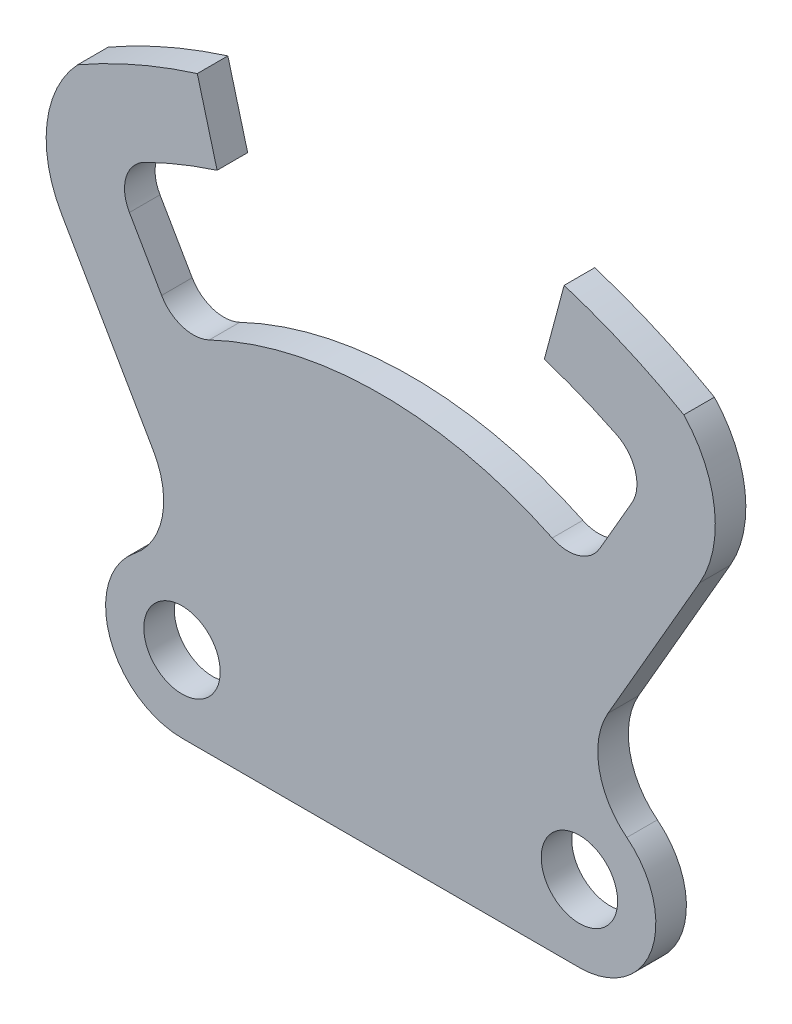
ISO-10303-21;
HEADER;
FILE_DESCRIPTION(('STEP AP214'),'2;1');
FILE_NAME('part.step','',(''),(''),'','','');
FILE_SCHEMA(('AUTOMOTIVE_DESIGN { 1 0 10303 214 1 1 1 1 }'));
ENDSEC;
DATA;
#1=APPLICATION_CONTEXT('core data for automotive mechanical design processes');
#2=APPLICATION_PROTOCOL_DEFINITION('international standard','automotive_design',2000,#1);
#3=PRODUCT_CONTEXT('',#1,'mechanical');
#4=PRODUCT('Part','Part','',(#3));
#5=PRODUCT_RELATED_PRODUCT_CATEGORY('part','',(#4));
#6=PRODUCT_DEFINITION_FORMATION('','',#4);
#7=PRODUCT_DEFINITION_CONTEXT('part definition',#1,'design');
#8=PRODUCT_DEFINITION('design','',#6,#7);
#9=PRODUCT_DEFINITION_SHAPE('','',#8);
#10=(LENGTH_UNIT() NAMED_UNIT(*) SI_UNIT(.MILLI.,.METRE.));
#11=(NAMED_UNIT(*) PLANE_ANGLE_UNIT() SI_UNIT($,.RADIAN.));
#12=(NAMED_UNIT(*) SI_UNIT($,.STERADIAN.) SOLID_ANGLE_UNIT());
#13=UNCERTAINTY_MEASURE_WITH_UNIT(LENGTH_MEASURE(1.E-05),#10,'distance_accuracy_value','');
#14=(GEOMETRIC_REPRESENTATION_CONTEXT(3) GLOBAL_UNCERTAINTY_ASSIGNED_CONTEXT((#13)) GLOBAL_UNIT_ASSIGNED_CONTEXT((#10,
#11,#12)) REPRESENTATION_CONTEXT('',''));
#15=CARTESIAN_POINT('',(0.,0.,0.));
#16=DIRECTION('',(0.,0.,1.));
#17=DIRECTION('',(1.,0.,0.));
#18=AXIS2_PLACEMENT_3D('',#15,#16,#17);
#19=CARTESIAN_POINT('',(65.,25.,10.));
#20=DIRECTION('',(0.,0.,1.));
#21=DIRECTION('',(1.,0.,0.));
#22=AXIS2_PLACEMENT_3D('',#19,#20,#21);
#23=PLANE('',#22);
#24=CARTESIAN_POINT('',(65.,25.,10.));
#25=DIRECTION('',(0.,0.,1.));
#26=DIRECTION('',(1.,0.,0.));
#27=AXIS2_PLACEMENT_3D('',#24,#25,#26);
#28=CIRCLE('',#27,12.5);
#29=CARTESIAN_POINT('',(77.5,25.,10.));
#30=VERTEX_POINT('',#29);
#31=EDGE_CURVE('E224',#30,#30,#28,.T.);
#32=ORIENTED_EDGE('',*,*,#31,.F.);
#33=EDGE_LOOP('',(#32));
#34=FACE_BOUND('',#33,.T.);
#35=CARTESIAN_POINT('',(65.,25.,10.));
#36=DIRECTION('',(0.,0.,1.));
#37=DIRECTION('',(1.,0.,0.));
#38=AXIS2_PLACEMENT_3D('',#35,#36,#37);
#39=CIRCLE('',#38,25.);
#40=CARTESIAN_POINT('',(65.,0.,10.));
#41=VERTEX_POINT('',#40);
#42=CARTESIAN_POINT('',(80.4997620073946,44.615233307665,10.));
#43=VERTEX_POINT('',#42);
#44=EDGE_CURVE('E263',#41,#43,#39,.T.);
#45=ORIENTED_EDGE('',*,*,#44,.T.);
#46=CARTESIAN_POINT('',(95.9995240147891,64.2304666153299,10.));
#47=DIRECTION('',(0.,0.,-1.));
#48=DIRECTION('',(-1.,0.,0.));
#49=AXIS2_PLACEMENT_3D('',#46,#47,#48);
#50=CIRCLE('',#49,25.);
#51=CARTESIAN_POINT('',(74.3488889201782,76.7304666153299,10.));
#52=VERTEX_POINT('',#51);
#53=EDGE_CURVE('E141',#43,#52,#50,.T.);
#54=ORIENTED_EDGE('',*,*,#53,.T.);
#55=DIRECTION('',(0.5,0.866025403784438,0.));
#56=VECTOR('',#55,1.);
#57=CARTESIAN_POINT('',(74.3488889201782,76.7304666153299,10.));
#58=LINE('',#57,#56);
#59=CARTESIAN_POINT('',(104.348888920178,128.691990842396,10.));
#60=VERTEX_POINT('',#59);
#61=EDGE_CURVE('E320',#52,#60,#58,.T.);
#62=ORIENTED_EDGE('',*,*,#61,.T.);
#63=CARTESIAN_POINT('',(71.4399235763695,147.691990842396,10.));
#64=DIRECTION('',(0.,0.,1.));
#65=DIRECTION('',(1.,0.,0.));
#66=AXIS2_PLACEMENT_3D('',#63,#64,#65);
#67=CIRCLE('',#66,38.);
#68=CARTESIAN_POINT('',(99.1537415113706,173.690919579281,10.));
#69=VERTEX_POINT('',#68);
#70=EDGE_CURVE('E339',#60,#69,#67,.T.);
#71=ORIENTED_EDGE('',*,*,#70,.T.);
#72=CARTESIAN_POINT('',(0.,0.,10.));
#73=DIRECTION('',(0.,0.,1.));
#74=DIRECTION('',(1.,0.,0.));
#75=AXIS2_PLACEMENT_3D('',#72,#73,#74);
#76=CIRCLE('',#75,200.);
#77=CARTESIAN_POINT('',(60.,190.787840283389,10.));
#78=VERTEX_POINT('',#77);
#79=EDGE_CURVE('E336',#69,#78,#76,.T.);
#80=ORIENTED_EDGE('',*,*,#79,.T.);
#81=DIRECTION('',(-0.258819045102521,-0.965925826289068,0.));
#82=VECTOR('',#81,1.);
#83=CARTESIAN_POINT('',(53.5227146224513,166.614282159255,10.));
#84=LINE('',#83,#82);
#85=CARTESIAN_POINT('',(53.5227146224514,166.614282159255,10.));
#86=VERTEX_POINT('',#85);
#87=EDGE_CURVE('E338',#78,#86,#84,.T.);
#88=ORIENTED_EDGE('',*,*,#87,.T.);
#89=CARTESIAN_POINT('',(0.,0.,10.));
#90=DIRECTION('',(0.,0.,-1.));
#91=DIRECTION('',(1.,0.,0.));
#92=AXIS2_PLACEMENT_3D('',#89,#90,#91);
#93=CIRCLE('',#92,175.);
#94=CARTESIAN_POINT('',(77.0949461283153,157.103053062225,10.));
#95=VERTEX_POINT('',#94);
#96=EDGE_CURVE('E341',#86,#95,#93,.T.);
#97=ORIENTED_EDGE('',*,*,#96,.T.);
#98=CARTESIAN_POINT('',(71.8084355366594,146.330272280815,10.));
#99=DIRECTION('',(0.,0.,-1.));
#100=DIRECTION('',(1.,0.,0.));
#101=AXIS2_PLACEMENT_3D('',#98,#99,#100);
#102=CIRCLE('',#101,12.);
#103=CARTESIAN_POINT('',(82.2007403820726,140.330272280815,10.));
#104=VERTEX_POINT('',#103);
#105=EDGE_CURVE('E347',#95,#104,#102,.T.);
#106=ORIENTED_EDGE('',*,*,#105,.T.);
#107=DIRECTION('',(-0.5,-0.866025403784439,0.));
#108=VECTOR('',#107,1.);
#109=CARTESIAN_POINT('',(71.6733007876133,122.096212029599,10.));
#110=LINE('',#109,#108);
#111=CARTESIAN_POINT('',(71.6733007876133,122.096212029599,10.));
#112=VERTEX_POINT('',#111);
#113=EDGE_CURVE('E349',#104,#112,#110,.T.);
#114=ORIENTED_EDGE('',*,*,#113,.T.);
#115=CARTESIAN_POINT('',(61.2809959422001,128.096212029599,10.));
#116=DIRECTION('',(0.,0.,-1.));
#117=DIRECTION('',(-1.,0.,0.));
#118=AXIS2_PLACEMENT_3D('',#115,#116,#117);
#119=CIRCLE('',#118,12.);
#120=CARTESIAN_POINT('',(56.1023202287747,117.271180027098,10.));
#121=VERTEX_POINT('',#120);
#122=EDGE_CURVE('E351',#112,#121,#119,.T.);
#123=ORIENTED_EDGE('',*,*,#122,.T.);
#124=CARTESIAN_POINT('',(0.,0.,10.));
#125=DIRECTION('',(0.,0.,1.));
#126=DIRECTION('',(1.,0.,0.));
#127=AXIS2_PLACEMENT_3D('',#124,#125,#126);
#128=CIRCLE('',#127,130.);
#129=CARTESIAN_POINT('',(-56.1023202287747,117.271180027098,10.));
#130=VERTEX_POINT('',#129);
#131=EDGE_CURVE('E353',#121,#130,#128,.T.);
#132=ORIENTED_EDGE('',*,*,#131,.T.);
#133=CARTESIAN_POINT('',(-61.2809959422001,128.096212029599,10.));
#134=DIRECTION('',(0.,0.,-1.));
#135=DIRECTION('',(1.,0.,0.));
#136=AXIS2_PLACEMENT_3D('',#133,#134,#135);
#137=CIRCLE('',#136,12.);
#138=CARTESIAN_POINT('',(-71.6733007876133,122.096212029599,10.));
#139=VERTEX_POINT('',#138);
#140=EDGE_CURVE('E355',#130,#139,#137,.T.);
#141=ORIENTED_EDGE('',*,*,#140,.T.);
#142=DIRECTION('',(-0.5,0.866025403784439,0.));
#143=VECTOR('',#142,1.);
#144=CARTESIAN_POINT('',(-71.6733007876133,122.096212029599,10.));
#145=LINE('',#144,#143);
#146=CARTESIAN_POINT('',(-82.2007403820727,140.330272280815,10.));
#147=VERTEX_POINT('',#146);
#148=EDGE_CURVE('E357',#139,#147,#145,.T.);
#149=ORIENTED_EDGE('',*,*,#148,.T.);
#150=CARTESIAN_POINT('',(-71.8084355366594,146.330272280815,10.));
#151=DIRECTION('',(0.,0.,-1.));
#152=DIRECTION('',(-1.,0.,0.));
#153=AXIS2_PLACEMENT_3D('',#150,#151,#152);
#154=CIRCLE('',#153,12.);
#155=CARTESIAN_POINT('',(-77.0949461283153,157.103053062225,10.));
#156=VERTEX_POINT('',#155);
#157=EDGE_CURVE('E359',#147,#156,#154,.T.);
#158=ORIENTED_EDGE('',*,*,#157,.T.);
#159=CARTESIAN_POINT('',(0.,0.,10.));
#160=DIRECTION('',(0.,0.,-1.));
#161=DIRECTION('',(-1.,0.,0.));
#162=AXIS2_PLACEMENT_3D('',#159,#160,#161);
#163=CIRCLE('',#162,175.);
#164=CARTESIAN_POINT('',(-53.5227146224513,166.614282159255,10.));
#165=VERTEX_POINT('',#164);
#166=EDGE_CURVE('E361',#156,#165,#163,.T.);
#167=ORIENTED_EDGE('',*,*,#166,.T.);
#168=DIRECTION('',(-0.258819045102521,0.965925826289068,0.));
#169=VECTOR('',#168,1.);
#170=CARTESIAN_POINT('',(-53.5227146224513,166.614282159255,10.));
#171=LINE('',#170,#169);
#172=CARTESIAN_POINT('',(-60.,190.787840283389,10.));
#173=VERTEX_POINT('',#172);
#174=EDGE_CURVE('E363',#165,#173,#171,.T.);
#175=ORIENTED_EDGE('',*,*,#174,.T.);
#176=CARTESIAN_POINT('',(0.,0.,10.));
#177=DIRECTION('',(0.,0.,1.));
#178=DIRECTION('',(-1.,0.,0.));
#179=AXIS2_PLACEMENT_3D('',#176,#177,#178);
#180=CIRCLE('',#179,200.);
#181=CARTESIAN_POINT('',(-99.1537415113706,173.690919579281,10.));
#182=VERTEX_POINT('',#181);
#183=EDGE_CURVE('E365',#173,#182,#180,.T.);
#184=ORIENTED_EDGE('',*,*,#183,.T.);
#185=CARTESIAN_POINT('',(-71.4399235763695,147.691990842396,10.));
#186=DIRECTION('',(0.,0.,1.));
#187=DIRECTION('',(-1.,0.,0.));
#188=AXIS2_PLACEMENT_3D('',#185,#186,#187);
#189=CIRCLE('',#188,38.);
#190=CARTESIAN_POINT('',(-104.348888920178,128.691990842396,10.));
#191=VERTEX_POINT('',#190);
#192=EDGE_CURVE('E367',#182,#191,#189,.T.);
#193=ORIENTED_EDGE('',*,*,#192,.T.);
#194=DIRECTION('',(0.5,-0.866025403784438,0.));
#195=VECTOR('',#194,1.);
#196=CARTESIAN_POINT('',(-74.3488889201782,76.7304666153299,10.));
#197=LINE('',#196,#195);
#198=CARTESIAN_POINT('',(-74.3488889201782,76.7304666153299,10.));
#199=VERTEX_POINT('',#198);
#200=EDGE_CURVE('E202',#191,#199,#197,.T.);
#201=ORIENTED_EDGE('',*,*,#200,.T.);
#202=CARTESIAN_POINT('',(-95.9995240147891,64.2304666153299,10.));
#203=DIRECTION('',(0.,0.,-1.));
#204=DIRECTION('',(1.,0.,0.));
#205=AXIS2_PLACEMENT_3D('',#202,#203,#204);
#206=CIRCLE('',#205,25.);
#207=CARTESIAN_POINT('',(-80.4997620073946,44.615233307665,10.));
#208=VERTEX_POINT('',#207);
#209=EDGE_CURVE('E196',#199,#208,#206,.T.);
#210=ORIENTED_EDGE('',*,*,#209,.T.);
#211=CARTESIAN_POINT('',(-65.,25.,10.));
#212=DIRECTION('',(0.,0.,1.));
#213=DIRECTION('',(-1.,0.,0.));
#214=AXIS2_PLACEMENT_3D('',#211,#212,#213);
#215=CIRCLE('',#214,25.);
#216=CARTESIAN_POINT('',(-65.,0.,10.));
#217=VERTEX_POINT('',#216);
#218=EDGE_CURVE('E200',#208,#217,#215,.T.);
#219=ORIENTED_EDGE('',*,*,#218,.T.);
#220=DIRECTION('',(1.,0.,0.));
#221=VECTOR('',#220,1.);
#222=CARTESIAN_POINT('',(-65.,0.,10.));
#223=LINE('',#222,#221);
#224=EDGE_CURVE('E56',#217,#41,#223,.T.);
#225=ORIENTED_EDGE('',*,*,#224,.T.);
#226=EDGE_LOOP('',(#45,#54,#62,#71,#80,#88,#97,#106,#114,#123,#132,#141,#149,#158,#167,#175,
#184,#193,#201,#210,#219,#225));
#227=FACE_BOUND('',#226,.T.);
#228=CARTESIAN_POINT('',(-65.,25.,10.));
#229=DIRECTION('',(0.,0.,1.));
#230=DIRECTION('',(-1.,0.,0.));
#231=AXIS2_PLACEMENT_3D('',#228,#229,#230);
#232=CIRCLE('',#231,12.5);
#233=CARTESIAN_POINT('',(-77.5,25.,10.));
#234=VERTEX_POINT('',#233);
#235=EDGE_CURVE('E409',#234,#234,#232,.T.);
#236=ORIENTED_EDGE('',*,*,#235,.F.);
#237=EDGE_LOOP('',(#236));
#238=FACE_BOUND('',#237,.T.);
#239=ADVANCED_FACE('F39',(#34,#227,#238),#23,.T.);
#240=CARTESIAN_POINT('',(65.,25.,0.));
#241=DIRECTION('',(0.,0.,1.));
#242=DIRECTION('',(1.,0.,0.));
#243=AXIS2_PLACEMENT_3D('',#240,#241,#242);
#244=PLANE('',#243);
#245=CARTESIAN_POINT('',(65.,25.,0.));
#246=DIRECTION('',(0.,0.,1.));
#247=DIRECTION('',(1.,0.,0.));
#248=AXIS2_PLACEMENT_3D('',#245,#246,#247);
#249=CIRCLE('',#248,25.);
#250=CARTESIAN_POINT('',(65.,0.,0.));
#251=VERTEX_POINT('',#250);
#252=CARTESIAN_POINT('',(80.4997620073946,44.615233307665,0.));
#253=VERTEX_POINT('',#252);
#254=EDGE_CURVE('E220',#251,#253,#249,.T.);
#255=ORIENTED_EDGE('',*,*,#254,.F.);
#256=DIRECTION('',(1.,0.,0.));
#257=VECTOR('',#256,1.);
#258=CARTESIAN_POINT('',(-65.,0.,0.));
#259=LINE('',#258,#257);
#260=CARTESIAN_POINT('',(-65.,0.,0.));
#261=VERTEX_POINT('',#260);
#262=EDGE_CURVE('E133',#261,#251,#259,.T.);
#263=ORIENTED_EDGE('',*,*,#262,.F.);
#264=CARTESIAN_POINT('',(-65.,25.,0.));
#265=DIRECTION('',(0.,0.,1.));
#266=DIRECTION('',(-1.,0.,0.));
#267=AXIS2_PLACEMENT_3D('',#264,#265,#266);
#268=CIRCLE('',#267,25.);
#269=CARTESIAN_POINT('',(-80.4997620073946,44.615233307665,0.));
#270=VERTEX_POINT('',#269);
#271=EDGE_CURVE('E127',#270,#261,#268,.T.);
#272=ORIENTED_EDGE('',*,*,#271,.F.);
#273=CARTESIAN_POINT('',(-95.9995240147891,64.2304666153299,0.));
#274=DIRECTION('',(0.,0.,-1.));
#275=DIRECTION('',(1.,0.,0.));
#276=AXIS2_PLACEMENT_3D('',#273,#274,#275);
#277=CIRCLE('',#276,25.);
#278=CARTESIAN_POINT('',(-74.3488889201782,76.7304666153299,0.));
#279=VERTEX_POINT('',#278);
#280=EDGE_CURVE('E210',#279,#270,#277,.T.);
#281=ORIENTED_EDGE('',*,*,#280,.F.);
#282=DIRECTION('',(0.5,-0.866025403784438,0.));
#283=VECTOR('',#282,1.);
#284=CARTESIAN_POINT('',(-74.3488889201782,76.7304666153299,0.));
#285=LINE('',#284,#283);
#286=CARTESIAN_POINT('',(-104.348888920178,128.691990842396,0.));
#287=VERTEX_POINT('',#286);
#288=EDGE_CURVE('E258',#287,#279,#285,.T.);
#289=ORIENTED_EDGE('',*,*,#288,.F.);
#290=CARTESIAN_POINT('',(-71.4399235763695,147.691990842396,0.));
#291=DIRECTION('',(0.,0.,1.));
#292=DIRECTION('',(-1.,0.,0.));
#293=AXIS2_PLACEMENT_3D('',#290,#291,#292);
#294=CIRCLE('',#293,38.);
#295=CARTESIAN_POINT('',(-99.1537415113706,173.690919579281,0.));
#296=VERTEX_POINT('',#295);
#297=EDGE_CURVE('E256',#296,#287,#294,.T.);
#298=ORIENTED_EDGE('',*,*,#297,.F.);
#299=CARTESIAN_POINT('',(0.,0.,0.));
#300=DIRECTION('',(0.,0.,1.));
#301=DIRECTION('',(-1.,0.,0.));
#302=AXIS2_PLACEMENT_3D('',#299,#300,#301);
#303=CIRCLE('',#302,200.);
#304=CARTESIAN_POINT('',(-60.,190.787840283389,0.));
#305=VERTEX_POINT('',#304);
#306=EDGE_CURVE('E254',#305,#296,#303,.T.);
#307=ORIENTED_EDGE('',*,*,#306,.F.);
#308=DIRECTION('',(-0.258819045102521,0.965925826289068,0.));
#309=VECTOR('',#308,1.);
#310=CARTESIAN_POINT('',(-53.5227146224513,166.614282159255,0.));
#311=LINE('',#310,#309);
#312=CARTESIAN_POINT('',(-53.5227146224513,166.614282159255,0.));
#313=VERTEX_POINT('',#312);
#314=EDGE_CURVE('E252',#313,#305,#311,.T.);
#315=ORIENTED_EDGE('',*,*,#314,.F.);
#316=CARTESIAN_POINT('',(0.,0.,0.));
#317=DIRECTION('',(0.,0.,-1.));
#318=DIRECTION('',(-1.,0.,0.));
#319=AXIS2_PLACEMENT_3D('',#316,#317,#318);
#320=CIRCLE('',#319,175.);
#321=CARTESIAN_POINT('',(-77.0949461283153,157.103053062225,0.));
#322=VERTEX_POINT('',#321);
#323=EDGE_CURVE('E250',#322,#313,#320,.T.);
#324=ORIENTED_EDGE('',*,*,#323,.F.);
#325=CARTESIAN_POINT('',(-71.8084355366594,146.330272280815,0.));
#326=DIRECTION('',(0.,0.,-1.));
#327=DIRECTION('',(-1.,0.,0.));
#328=AXIS2_PLACEMENT_3D('',#325,#326,#327);
#329=CIRCLE('',#328,12.);
#330=CARTESIAN_POINT('',(-82.2007403820727,140.330272280815,0.));
#331=VERTEX_POINT('',#330);
#332=EDGE_CURVE('E248',#331,#322,#329,.T.);
#333=ORIENTED_EDGE('',*,*,#332,.F.);
#334=DIRECTION('',(-0.5,0.866025403784439,0.));
#335=VECTOR('',#334,1.);
#336=CARTESIAN_POINT('',(-71.6733007876133,122.096212029599,0.));
#337=LINE('',#336,#335);
#338=CARTESIAN_POINT('',(-71.6733007876133,122.096212029599,0.));
#339=VERTEX_POINT('',#338);
#340=EDGE_CURVE('E246',#339,#331,#337,.T.);
#341=ORIENTED_EDGE('',*,*,#340,.F.);
#342=CARTESIAN_POINT('',(-61.2809959422001,128.096212029599,0.));
#343=DIRECTION('',(0.,0.,-1.));
#344=DIRECTION('',(1.,0.,0.));
#345=AXIS2_PLACEMENT_3D('',#342,#343,#344);
#346=CIRCLE('',#345,12.);
#347=CARTESIAN_POINT('',(-56.1023202287747,117.271180027098,0.));
#348=VERTEX_POINT('',#347);
#349=EDGE_CURVE('E244',#348,#339,#346,.T.);
#350=ORIENTED_EDGE('',*,*,#349,.F.);
#351=CARTESIAN_POINT('',(0.,0.,0.));
#352=DIRECTION('',(0.,0.,1.));
#353=DIRECTION('',(1.,0.,0.));
#354=AXIS2_PLACEMENT_3D('',#351,#352,#353);
#355=CIRCLE('',#354,130.);
#356=CARTESIAN_POINT('',(56.1023202287747,117.271180027098,0.));
#357=VERTEX_POINT('',#356);
#358=EDGE_CURVE('E242',#357,#348,#355,.T.);
#359=ORIENTED_EDGE('',*,*,#358,.F.);
#360=CARTESIAN_POINT('',(61.2809959422001,128.096212029599,0.));
#361=DIRECTION('',(0.,0.,-1.));
#362=DIRECTION('',(-1.,0.,0.));
#363=AXIS2_PLACEMENT_3D('',#360,#361,#362);
#364=CIRCLE('',#363,12.);
#365=CARTESIAN_POINT('',(71.6733007876133,122.096212029599,0.));
#366=VERTEX_POINT('',#365);
#367=EDGE_CURVE('E240',#366,#357,#364,.T.);
#368=ORIENTED_EDGE('',*,*,#367,.F.);
#369=DIRECTION('',(-0.5,-0.866025403784439,0.));
#370=VECTOR('',#369,1.);
#371=CARTESIAN_POINT('',(71.6733007876133,122.096212029599,0.));
#372=LINE('',#371,#370);
#373=CARTESIAN_POINT('',(82.2007403820726,140.330272280815,0.));
#374=VERTEX_POINT('',#373);
#375=EDGE_CURVE('E238',#374,#366,#372,.T.);
#376=ORIENTED_EDGE('',*,*,#375,.F.);
#377=CARTESIAN_POINT('',(71.8084355366594,146.330272280815,0.));
#378=DIRECTION('',(0.,0.,-1.));
#379=DIRECTION('',(1.,0.,0.));
#380=AXIS2_PLACEMENT_3D('',#377,#378,#379);
#381=CIRCLE('',#380,12.);
#382=CARTESIAN_POINT('',(77.0949461283153,157.103053062225,0.));
#383=VERTEX_POINT('',#382);
#384=EDGE_CURVE('E236',#383,#374,#381,.T.);
#385=ORIENTED_EDGE('',*,*,#384,.F.);
#386=CARTESIAN_POINT('',(0.,0.,0.));
#387=DIRECTION('',(0.,0.,-1.));
#388=DIRECTION('',(1.,0.,0.));
#389=AXIS2_PLACEMENT_3D('',#386,#387,#388);
#390=CIRCLE('',#389,175.);
#391=CARTESIAN_POINT('',(53.5227146224514,166.614282159255,0.));
#392=VERTEX_POINT('',#391);
#393=EDGE_CURVE('E234',#392,#383,#390,.T.);
#394=ORIENTED_EDGE('',*,*,#393,.F.);
#395=DIRECTION('',(-0.258819045102521,-0.965925826289068,0.));
#396=VECTOR('',#395,1.);
#397=CARTESIAN_POINT('',(53.5227146224513,166.614282159255,0.));
#398=LINE('',#397,#396);
#399=CARTESIAN_POINT('',(60.,190.787840283389,0.));
#400=VERTEX_POINT('',#399);
#401=EDGE_CURVE('E232',#400,#392,#398,.T.);
#402=ORIENTED_EDGE('',*,*,#401,.F.);
#403=CARTESIAN_POINT('',(0.,0.,0.));
#404=DIRECTION('',(0.,0.,1.));
#405=DIRECTION('',(1.,0.,0.));
#406=AXIS2_PLACEMENT_3D('',#403,#404,#405);
#407=CIRCLE('',#406,200.);
#408=CARTESIAN_POINT('',(99.1537415113706,173.690919579281,0.));
#409=VERTEX_POINT('',#408);
#410=EDGE_CURVE('E230',#409,#400,#407,.T.);
#411=ORIENTED_EDGE('',*,*,#410,.F.);
#412=CARTESIAN_POINT('',(71.4399235763695,147.691990842396,0.));
#413=DIRECTION('',(0.,0.,1.));
#414=DIRECTION('',(1.,0.,0.));
#415=AXIS2_PLACEMENT_3D('',#412,#413,#414);
#416=CIRCLE('',#415,38.);
#417=CARTESIAN_POINT('',(104.348888920178,128.691990842396,0.));
#418=VERTEX_POINT('',#417);
#419=EDGE_CURVE('E228',#418,#409,#416,.T.);
#420=ORIENTED_EDGE('',*,*,#419,.F.);
#421=DIRECTION('',(0.5,0.866025403784438,0.));
#422=VECTOR('',#421,1.);
#423=CARTESIAN_POINT('',(74.3488889201782,76.7304666153299,0.));
#424=LINE('',#423,#422);
#425=CARTESIAN_POINT('',(74.3488889201782,76.7304666153299,0.));
#426=VERTEX_POINT('',#425);
#427=EDGE_CURVE('E226',#426,#418,#424,.T.);
#428=ORIENTED_EDGE('',*,*,#427,.F.);
#429=CARTESIAN_POINT('',(95.9995240147891,64.2304666153299,0.));
#430=DIRECTION('',(0.,0.,-1.));
#431=DIRECTION('',(-1.,0.,0.));
#432=AXIS2_PLACEMENT_3D('',#429,#430,#431);
#433=CIRCLE('',#432,25.);
#434=EDGE_CURVE('E223',#253,#426,#433,.T.);
#435=ORIENTED_EDGE('',*,*,#434,.F.);
#436=EDGE_LOOP('',(#255,#263,#272,#281,#289,#298,#307,#315,#324,#333,#341,#350,#359,#368,#376,
#385,#394,#402,#411,#420,#428,#435));
#437=FACE_BOUND('',#436,.T.);
#438=CARTESIAN_POINT('',(65.,25.,0.));
#439=DIRECTION('',(0.,0.,1.));
#440=DIRECTION('',(1.,0.,0.));
#441=AXIS2_PLACEMENT_3D('',#438,#439,#440);
#442=CIRCLE('',#441,12.5);
#443=CARTESIAN_POINT('',(77.5,25.,0.));
#444=VERTEX_POINT('',#443);
#445=EDGE_CURVE('E415',#444,#444,#442,.T.);
#446=ORIENTED_EDGE('',*,*,#445,.T.);
#447=EDGE_LOOP('',(#446));
#448=FACE_BOUND('',#447,.T.);
#449=CARTESIAN_POINT('',(-65.,25.,0.));
#450=DIRECTION('',(0.,0.,1.));
#451=DIRECTION('',(-1.,0.,0.));
#452=AXIS2_PLACEMENT_3D('',#449,#450,#451);
#453=CIRCLE('',#452,12.5);
#454=CARTESIAN_POINT('',(-77.5,25.,0.));
#455=VERTEX_POINT('',#454);
#456=EDGE_CURVE('E412',#455,#455,#453,.T.);
#457=ORIENTED_EDGE('',*,*,#456,.T.);
#458=EDGE_LOOP('',(#457));
#459=FACE_BOUND('',#458,.T.);
#460=ADVANCED_FACE('F324',(#437,#448,#459),#244,.F.);
#461=CARTESIAN_POINT('',(65.,25.,10.));
#462=DIRECTION('',(0.,0.,-1.));
#463=DIRECTION('',(-1.,0.,0.));
#464=AXIS2_PLACEMENT_3D('',#461,#462,#463);
#465=CYLINDRICAL_SURFACE('',#464,25.);
#466=ORIENTED_EDGE('',*,*,#254,.T.);
#467=DIRECTION('',(0.,0.,-1.));
#468=VECTOR('',#467,1.);
#469=CARTESIAN_POINT('',(80.4997620073946,44.615233307665,10.));
#470=LINE('',#469,#468);
#471=EDGE_CURVE('E11',#43,#253,#470,.T.);
#472=ORIENTED_EDGE('',*,*,#471,.F.);
#473=ORIENTED_EDGE('',*,*,#44,.F.);
#474=DIRECTION('',(0.,0.,-1.));
#475=VECTOR('',#474,1.);
#476=CARTESIAN_POINT('',(65.,0.,10.));
#477=LINE('',#476,#475);
#478=EDGE_CURVE('E216',#41,#251,#477,.T.);
#479=ORIENTED_EDGE('',*,*,#478,.T.);
#480=EDGE_LOOP('',(#466,#472,#473,#479));
#481=FACE_BOUND('',#480,.T.);
#482=ADVANCED_FACE('F41',(#481),#465,.T.);
#483=CARTESIAN_POINT('',(95.9995240147891,64.2304666153299,10.));
#484=DIRECTION('',(0.,0.,-1.));
#485=DIRECTION('',(-1.,0.,0.));
#486=AXIS2_PLACEMENT_3D('',#483,#484,#485);
#487=CYLINDRICAL_SURFACE('',#486,25.);
#488=ORIENTED_EDGE('',*,*,#434,.T.);
#489=DIRECTION('',(0.,0.,-1.));
#490=VECTOR('',#489,1.);
#491=CARTESIAN_POINT('',(74.3488889201782,76.7304666153299,10.));
#492=LINE('',#491,#490);
#493=EDGE_CURVE('E48',#52,#426,#492,.T.);
#494=ORIENTED_EDGE('',*,*,#493,.F.);
#495=ORIENTED_EDGE('',*,*,#53,.F.);
#496=ORIENTED_EDGE('',*,*,#471,.T.);
#497=EDGE_LOOP('',(#488,#494,#495,#496));
#498=FACE_BOUND('',#497,.T.);
#499=ADVANCED_FACE('F568',(#498),#487,.F.);
#500=CARTESIAN_POINT('',(74.3488889201782,76.7304666153299,10.));
#501=DIRECTION('',(-0.866025403784438,0.5,0.));
#502=DIRECTION('',(-0.5,-0.866025403784438,0.));
#503=AXIS2_PLACEMENT_3D('',#500,#501,#502);
#504=PLANE('',#503);
#505=ORIENTED_EDGE('',*,*,#427,.T.);
#506=DIRECTION('',(0.,0.,-1.));
#507=VECTOR('',#506,1.);
#508=CARTESIAN_POINT('',(104.348888920178,128.691990842396,10.));
#509=LINE('',#508,#507);
#510=EDGE_CURVE('E312',#60,#418,#509,.T.);
#511=ORIENTED_EDGE('',*,*,#510,.F.);
#512=ORIENTED_EDGE('',*,*,#61,.F.);
#513=ORIENTED_EDGE('',*,*,#493,.T.);
#514=EDGE_LOOP('',(#505,#511,#512,#513));
#515=FACE_BOUND('',#514,.T.);
#516=ADVANCED_FACE('F318',(#515),#504,.F.);
#517=CARTESIAN_POINT('',(71.4399235763695,147.691990842396,10.));
#518=DIRECTION('',(0.,0.,-1.));
#519=DIRECTION('',(-1.,0.,0.));
#520=AXIS2_PLACEMENT_3D('',#517,#518,#519);
#521=CYLINDRICAL_SURFACE('',#520,38.);
#522=ORIENTED_EDGE('',*,*,#419,.T.);
#523=DIRECTION('',(0.,0.,-1.));
#524=VECTOR('',#523,1.);
#525=CARTESIAN_POINT('',(99.1537415113706,173.690919579281,10.));
#526=LINE('',#525,#524);
#527=EDGE_CURVE('E309',#69,#409,#526,.T.);
#528=ORIENTED_EDGE('',*,*,#527,.F.);
#529=ORIENTED_EDGE('',*,*,#70,.F.);
#530=ORIENTED_EDGE('',*,*,#510,.T.);
#531=EDGE_LOOP('',(#522,#528,#529,#530));
#532=FACE_BOUND('',#531,.T.);
#533=ADVANCED_FACE('F330',(#532),#521,.T.);
#534=CARTESIAN_POINT('',(0.,0.,10.));
#535=DIRECTION('',(0.,0.,-1.));
#536=DIRECTION('',(-1.,0.,0.));
#537=AXIS2_PLACEMENT_3D('',#534,#535,#536);
#538=CYLINDRICAL_SURFACE('',#537,200.);
#539=ORIENTED_EDGE('',*,*,#410,.T.);
#540=DIRECTION('',(0.,0.,-1.));
#541=VECTOR('',#540,1.);
#542=CARTESIAN_POINT('',(60.,190.787840283389,10.));
#543=LINE('',#542,#541);
#544=EDGE_CURVE('E306',#78,#400,#543,.T.);
#545=ORIENTED_EDGE('',*,*,#544,.F.);
#546=ORIENTED_EDGE('',*,*,#79,.F.);
#547=ORIENTED_EDGE('',*,*,#527,.T.);
#548=EDGE_LOOP('',(#539,#545,#546,#547));
#549=FACE_BOUND('',#548,.T.);
#550=ADVANCED_FACE('F334',(#549),#538,.T.);
#551=CARTESIAN_POINT('',(53.5227146224513,166.614282159255,10.));
#552=DIRECTION('',(0.965925826289068,-0.258819045102521,0.));
#553=DIRECTION('',(0.258819045102521,0.965925826289068,0.));
#554=AXIS2_PLACEMENT_3D('',#551,#552,#553);
#555=PLANE('',#554);
#556=ORIENTED_EDGE('',*,*,#401,.T.);
#557=DIRECTION('',(0.,0.,-1.));
#558=VECTOR('',#557,1.);
#559=CARTESIAN_POINT('',(53.5227146224514,166.614282159255,10.));
#560=LINE('',#559,#558);
#561=EDGE_CURVE('E303',#86,#392,#560,.T.);
#562=ORIENTED_EDGE('',*,*,#561,.F.);
#563=ORIENTED_EDGE('',*,*,#87,.F.);
#564=ORIENTED_EDGE('',*,*,#544,.T.);
#565=EDGE_LOOP('',(#556,#562,#563,#564));
#566=FACE_BOUND('',#565,.T.);
#567=ADVANCED_FACE('F541',(#566),#555,.F.);
#568=CARTESIAN_POINT('',(0.,0.,10.));
#569=DIRECTION('',(0.,0.,-1.));
#570=DIRECTION('',(-1.,0.,0.));
#571=AXIS2_PLACEMENT_3D('',#568,#569,#570);
#572=CYLINDRICAL_SURFACE('',#571,175.);
#573=ORIENTED_EDGE('',*,*,#393,.T.);
#574=DIRECTION('',(0.,0.,-1.));
#575=VECTOR('',#574,1.);
#576=CARTESIAN_POINT('',(77.0949461283153,157.103053062225,10.));
#577=LINE('',#576,#575);
#578=EDGE_CURVE('E300',#95,#383,#577,.T.);
#579=ORIENTED_EDGE('',*,*,#578,.F.);
#580=ORIENTED_EDGE('',*,*,#96,.F.);
#581=ORIENTED_EDGE('',*,*,#561,.T.);
#582=EDGE_LOOP('',(#573,#579,#580,#581));
#583=FACE_BOUND('',#582,.T.);
#584=ADVANCED_FACE('F533',(#583),#572,.F.);
#585=CARTESIAN_POINT('',(71.8084355366594,146.330272280815,10.));
#586=DIRECTION('',(0.,0.,-1.));
#587=DIRECTION('',(-1.,0.,0.));
#588=AXIS2_PLACEMENT_3D('',#585,#586,#587);
#589=CYLINDRICAL_SURFACE('',#588,12.);
#590=ORIENTED_EDGE('',*,*,#384,.T.);
#591=DIRECTION('',(0.,0.,-1.));
#592=VECTOR('',#591,1.);
#593=CARTESIAN_POINT('',(82.2007403820726,140.330272280815,10.));
#594=LINE('',#593,#592);
#595=EDGE_CURVE('E297',#104,#374,#594,.T.);
#596=ORIENTED_EDGE('',*,*,#595,.F.);
#597=ORIENTED_EDGE('',*,*,#105,.F.);
#598=ORIENTED_EDGE('',*,*,#578,.T.);
#599=EDGE_LOOP('',(#590,#596,#597,#598));
#600=FACE_BOUND('',#599,.T.);
#601=ADVANCED_FACE('F525',(#600),#589,.F.);
#602=CARTESIAN_POINT('',(71.6733007876133,122.096212029599,10.));
#603=DIRECTION('',(0.866025403784439,-0.5,0.));
#604=DIRECTION('',(0.5,0.866025403784439,0.));
#605=AXIS2_PLACEMENT_3D('',#602,#603,#604);
#606=PLANE('',#605);
#607=ORIENTED_EDGE('',*,*,#375,.T.);
#608=DIRECTION('',(0.,0.,-1.));
#609=VECTOR('',#608,1.);
#610=CARTESIAN_POINT('',(71.6733007876133,122.096212029599,10.));
#611=LINE('',#610,#609);
#612=EDGE_CURVE('E294',#112,#366,#611,.T.);
#613=ORIENTED_EDGE('',*,*,#612,.F.);
#614=ORIENTED_EDGE('',*,*,#113,.F.);
#615=ORIENTED_EDGE('',*,*,#595,.T.);
#616=EDGE_LOOP('',(#607,#613,#614,#615));
#617=FACE_BOUND('',#616,.T.);
#618=ADVANCED_FACE('F517',(#617),#606,.F.);
#619=CARTESIAN_POINT('',(61.2809959422001,128.096212029599,10.));
#620=DIRECTION('',(0.,0.,-1.));
#621=DIRECTION('',(-1.,0.,0.));
#622=AXIS2_PLACEMENT_3D('',#619,#620,#621);
#623=CYLINDRICAL_SURFACE('',#622,12.);
#624=ORIENTED_EDGE('',*,*,#367,.T.);
#625=DIRECTION('',(0.,0.,-1.));
#626=VECTOR('',#625,1.);
#627=CARTESIAN_POINT('',(56.1023202287747,117.271180027098,10.));
#628=LINE('',#627,#626);
#629=EDGE_CURVE('E291',#121,#357,#628,.T.);
#630=ORIENTED_EDGE('',*,*,#629,.F.);
#631=ORIENTED_EDGE('',*,*,#122,.F.);
#632=ORIENTED_EDGE('',*,*,#612,.T.);
#633=EDGE_LOOP('',(#624,#630,#631,#632));
#634=FACE_BOUND('',#633,.T.);
#635=ADVANCED_FACE('F509',(#634),#623,.F.);
#636=CARTESIAN_POINT('',(0.,0.,10.));
#637=DIRECTION('',(0.,0.,-1.));
#638=DIRECTION('',(-1.,0.,0.));
#639=AXIS2_PLACEMENT_3D('',#636,#637,#638);
#640=CYLINDRICAL_SURFACE('',#639,130.);
#641=ORIENTED_EDGE('',*,*,#358,.T.);
#642=DIRECTION('',(0.,0.,-1.));
#643=VECTOR('',#642,1.);
#644=CARTESIAN_POINT('',(-56.1023202287747,117.271180027098,10.));
#645=LINE('',#644,#643);
#646=EDGE_CURVE('E288',#130,#348,#645,.T.);
#647=ORIENTED_EDGE('',*,*,#646,.F.);
#648=ORIENTED_EDGE('',*,*,#131,.F.);
#649=ORIENTED_EDGE('',*,*,#629,.T.);
#650=EDGE_LOOP('',(#641,#647,#648,#649));
#651=FACE_BOUND('',#650,.T.);
#652=ADVANCED_FACE('F501',(#651),#640,.T.);
#653=CARTESIAN_POINT('',(-61.2809959422001,128.096212029599,10.));
#654=DIRECTION('',(0.,0.,-1.));
#655=DIRECTION('',(-1.,0.,0.));
#656=AXIS2_PLACEMENT_3D('',#653,#654,#655);
#657=CYLINDRICAL_SURFACE('',#656,12.);
#658=ORIENTED_EDGE('',*,*,#349,.T.);
#659=DIRECTION('',(0.,0.,-1.));
#660=VECTOR('',#659,1.);
#661=CARTESIAN_POINT('',(-71.6733007876133,122.096212029599,10.));
#662=LINE('',#661,#660);
#663=EDGE_CURVE('E285',#139,#339,#662,.T.);
#664=ORIENTED_EDGE('',*,*,#663,.F.);
#665=ORIENTED_EDGE('',*,*,#140,.F.);
#666=ORIENTED_EDGE('',*,*,#646,.T.);
#667=EDGE_LOOP('',(#658,#664,#665,#666));
#668=FACE_BOUND('',#667,.T.);
#669=ADVANCED_FACE('F493',(#668),#657,.F.);
#670=CARTESIAN_POINT('',(-71.6733007876133,122.096212029599,10.));
#671=DIRECTION('',(-0.866025403784439,-0.5,0.));
#672=DIRECTION('',(0.5,-0.866025403784439,0.));
#673=AXIS2_PLACEMENT_3D('',#670,#671,#672);
#674=PLANE('',#673);
#675=ORIENTED_EDGE('',*,*,#340,.T.);
#676=DIRECTION('',(0.,0.,-1.));
#677=VECTOR('',#676,1.);
#678=CARTESIAN_POINT('',(-82.2007403820727,140.330272280815,10.));
#679=LINE('',#678,#677);
#680=EDGE_CURVE('E282',#147,#331,#679,.T.);
#681=ORIENTED_EDGE('',*,*,#680,.F.);
#682=ORIENTED_EDGE('',*,*,#148,.F.);
#683=ORIENTED_EDGE('',*,*,#663,.T.);
#684=EDGE_LOOP('',(#675,#681,#682,#683));
#685=FACE_BOUND('',#684,.T.);
#686=ADVANCED_FACE('F485',(#685),#674,.F.);
#687=CARTESIAN_POINT('',(-71.8084355366594,146.330272280815,10.));
#688=DIRECTION('',(0.,0.,-1.));
#689=DIRECTION('',(-1.,0.,0.));
#690=AXIS2_PLACEMENT_3D('',#687,#688,#689);
#691=CYLINDRICAL_SURFACE('',#690,12.);
#692=ORIENTED_EDGE('',*,*,#332,.T.);
#693=DIRECTION('',(0.,0.,-1.));
#694=VECTOR('',#693,1.);
#695=CARTESIAN_POINT('',(-77.0949461283153,157.103053062225,10.));
#696=LINE('',#695,#694);
#697=EDGE_CURVE('E279',#156,#322,#696,.T.);
#698=ORIENTED_EDGE('',*,*,#697,.F.);
#699=ORIENTED_EDGE('',*,*,#157,.F.);
#700=ORIENTED_EDGE('',*,*,#680,.T.);
#701=EDGE_LOOP('',(#692,#698,#699,#700));
#702=FACE_BOUND('',#701,.T.);
#703=ADVANCED_FACE('F477',(#702),#691,.F.);
#704=CARTESIAN_POINT('',(0.,0.,10.));
#705=DIRECTION('',(0.,0.,-1.));
#706=DIRECTION('',(-1.,0.,0.));
#707=AXIS2_PLACEMENT_3D('',#704,#705,#706);
#708=CYLINDRICAL_SURFACE('',#707,175.);
#709=ORIENTED_EDGE('',*,*,#323,.T.);
#710=DIRECTION('',(0.,0.,-1.));
#711=VECTOR('',#710,1.);
#712=CARTESIAN_POINT('',(-53.5227146224513,166.614282159255,10.));
#713=LINE('',#712,#711);
#714=EDGE_CURVE('E276',#165,#313,#713,.T.);
#715=ORIENTED_EDGE('',*,*,#714,.F.);
#716=ORIENTED_EDGE('',*,*,#166,.F.);
#717=ORIENTED_EDGE('',*,*,#697,.T.);
#718=EDGE_LOOP('',(#709,#715,#716,#717));
#719=FACE_BOUND('',#718,.T.);
#720=ADVANCED_FACE('F469',(#719),#708,.F.);
#721=CARTESIAN_POINT('',(-53.5227146224513,166.614282159255,10.));
#722=DIRECTION('',(-0.965925826289068,-0.258819045102521,0.));
#723=DIRECTION('',(0.258819045102521,-0.965925826289068,0.));
#724=AXIS2_PLACEMENT_3D('',#721,#722,#723);
#725=PLANE('',#724);
#726=ORIENTED_EDGE('',*,*,#314,.T.);
#727=DIRECTION('',(0.,0.,-1.));
#728=VECTOR('',#727,1.);
#729=CARTESIAN_POINT('',(-60.,190.787840283389,10.));
#730=LINE('',#729,#728);
#731=EDGE_CURVE('E273',#173,#305,#730,.T.);
#732=ORIENTED_EDGE('',*,*,#731,.F.);
#733=ORIENTED_EDGE('',*,*,#174,.F.);
#734=ORIENTED_EDGE('',*,*,#714,.T.);
#735=EDGE_LOOP('',(#726,#732,#733,#734));
#736=FACE_BOUND('',#735,.T.);
#737=ADVANCED_FACE('F461',(#736),#725,.F.);
#738=CARTESIAN_POINT('',(0.,0.,10.));
#739=DIRECTION('',(0.,0.,-1.));
#740=DIRECTION('',(-1.,0.,0.));
#741=AXIS2_PLACEMENT_3D('',#738,#739,#740);
#742=CYLINDRICAL_SURFACE('',#741,200.);
#743=ORIENTED_EDGE('',*,*,#306,.T.);
#744=DIRECTION('',(0.,0.,-1.));
#745=VECTOR('',#744,1.);
#746=CARTESIAN_POINT('',(-99.1537415113706,173.690919579281,10.));
#747=LINE('',#746,#745);
#748=EDGE_CURVE('E270',#182,#296,#747,.T.);
#749=ORIENTED_EDGE('',*,*,#748,.F.);
#750=ORIENTED_EDGE('',*,*,#183,.F.);
#751=ORIENTED_EDGE('',*,*,#731,.T.);
#752=EDGE_LOOP('',(#743,#749,#750,#751));
#753=FACE_BOUND('',#752,.T.);
#754=ADVANCED_FACE('F454',(#753),#742,.T.);
#755=CARTESIAN_POINT('',(-71.4399235763695,147.691990842396,10.));
#756=DIRECTION('',(0.,0.,-1.));
#757=DIRECTION('',(-1.,0.,0.));
#758=AXIS2_PLACEMENT_3D('',#755,#756,#757);
#759=CYLINDRICAL_SURFACE('',#758,38.);
#760=ORIENTED_EDGE('',*,*,#297,.T.);
#761=DIRECTION('',(0.,0.,-1.));
#762=VECTOR('',#761,1.);
#763=CARTESIAN_POINT('',(-104.348888920178,128.691990842396,10.));
#764=LINE('',#763,#762);
#765=EDGE_CURVE('E267',#191,#287,#764,.T.);
#766=ORIENTED_EDGE('',*,*,#765,.F.);
#767=ORIENTED_EDGE('',*,*,#192,.F.);
#768=ORIENTED_EDGE('',*,*,#748,.T.);
#769=EDGE_LOOP('',(#760,#766,#767,#768));
#770=FACE_BOUND('',#769,.T.);
#771=ADVANCED_FACE('F373',(#770),#759,.T.);
#772=CARTESIAN_POINT('',(-74.3488889201782,76.7304666153299,10.));
#773=DIRECTION('',(0.866025403784438,0.5,0.));
#774=DIRECTION('',(-0.5,0.866025403784438,0.));
#775=AXIS2_PLACEMENT_3D('',#772,#773,#774);
#776=PLANE('',#775);
#777=ORIENTED_EDGE('',*,*,#288,.T.);
#778=DIRECTION('',(0.,0.,-1.));
#779=VECTOR('',#778,1.);
#780=CARTESIAN_POINT('',(-74.3488889201782,76.7304666153299,10.));
#781=LINE('',#780,#779);
#782=EDGE_CURVE('E211',#199,#279,#781,.T.);
#783=ORIENTED_EDGE('',*,*,#782,.F.);
#784=ORIENTED_EDGE('',*,*,#200,.F.);
#785=ORIENTED_EDGE('',*,*,#765,.T.);
#786=EDGE_LOOP('',(#777,#783,#784,#785));
#787=FACE_BOUND('',#786,.T.);
#788=ADVANCED_FACE('F377',(#787),#776,.F.);
#789=CARTESIAN_POINT('',(-95.9995240147891,64.2304666153299,10.));
#790=DIRECTION('',(0.,0.,-1.));
#791=DIRECTION('',(-1.,0.,0.));
#792=AXIS2_PLACEMENT_3D('',#789,#790,#791);
#793=CYLINDRICAL_SURFACE('',#792,25.);
#794=ORIENTED_EDGE('',*,*,#280,.T.);
#795=DIRECTION('',(0.,0.,-1.));
#796=VECTOR('',#795,1.);
#797=CARTESIAN_POINT('',(-80.4997620073946,44.615233307665,10.));
#798=LINE('',#797,#796);
#799=EDGE_CURVE('E207',#208,#270,#798,.T.);
#800=ORIENTED_EDGE('',*,*,#799,.F.);
#801=ORIENTED_EDGE('',*,*,#209,.F.);
#802=ORIENTED_EDGE('',*,*,#782,.T.);
#803=EDGE_LOOP('',(#794,#800,#801,#802));
#804=FACE_BOUND('',#803,.T.);
#805=ADVANCED_FACE('F208',(#804),#793,.F.);
#806=CARTESIAN_POINT('',(-65.,25.,10.));
#807=DIRECTION('',(0.,0.,-1.));
#808=DIRECTION('',(-1.,0.,0.));
#809=AXIS2_PLACEMENT_3D('',#806,#807,#808);
#810=CYLINDRICAL_SURFACE('',#809,25.);
#811=ORIENTED_EDGE('',*,*,#271,.T.);
#812=DIRECTION('',(0.,0.,-1.));
#813=VECTOR('',#812,1.);
#814=CARTESIAN_POINT('',(-65.,0.,10.));
#815=LINE('',#814,#813);
#816=EDGE_CURVE('E212',#217,#261,#815,.T.);
#817=ORIENTED_EDGE('',*,*,#816,.F.);
#818=ORIENTED_EDGE('',*,*,#218,.F.);
#819=ORIENTED_EDGE('',*,*,#799,.T.);
#820=EDGE_LOOP('',(#811,#817,#818,#819));
#821=FACE_BOUND('',#820,.T.);
#822=ADVANCED_FACE('F214',(#821),#810,.T.);
#823=CARTESIAN_POINT('',(-65.,0.,10.));
#824=DIRECTION('',(0.,1.,0.));
#825=DIRECTION('',(0.,0.,1.));
#826=AXIS2_PLACEMENT_3D('',#823,#824,#825);
#827=PLANE('',#826);
#828=ORIENTED_EDGE('',*,*,#262,.T.);
#829=ORIENTED_EDGE('',*,*,#478,.F.);
#830=ORIENTED_EDGE('',*,*,#224,.F.);
#831=ORIENTED_EDGE('',*,*,#816,.T.);
#832=EDGE_LOOP('',(#828,#829,#830,#831));
#833=FACE_BOUND('',#832,.T.);
#834=ADVANCED_FACE('F381',(#833),#827,.F.);
#835=CARTESIAN_POINT('',(65.,25.,10.));
#836=DIRECTION('',(0.,0.,-1.));
#837=DIRECTION('',(-1.,0.,0.));
#838=AXIS2_PLACEMENT_3D('',#835,#836,#837);
#839=CYLINDRICAL_SURFACE('',#838,12.5);
#840=ORIENTED_EDGE('',*,*,#31,.T.);
#841=EDGE_LOOP('',(#840));
#842=FACE_BOUND('',#841,.T.);
#843=ORIENTED_EDGE('',*,*,#445,.F.);
#844=EDGE_LOOP('',(#843));
#845=FACE_BOUND('',#844,.T.);
#846=ADVANCED_FACE('F383',(#842,#845),#839,.F.);
#847=CARTESIAN_POINT('',(-65.,25.,10.));
#848=DIRECTION('',(0.,0.,-1.));
#849=DIRECTION('',(-1.,0.,0.));
#850=AXIS2_PLACEMENT_3D('',#847,#848,#849);
#851=CYLINDRICAL_SURFACE('',#850,12.5);
#852=ORIENTED_EDGE('',*,*,#235,.T.);
#853=EDGE_LOOP('',(#852));
#854=FACE_BOUND('',#853,.T.);
#855=ORIENTED_EDGE('',*,*,#456,.F.);
#856=EDGE_LOOP('',(#855));
#857=FACE_BOUND('',#856,.T.);
#858=ADVANCED_FACE('F389',(#854,#857),#851,.F.);
#859=CLOSED_SHELL('',(#239,#460,#482,#499,#516,#533,#550,#567,#584,#601,#618,#635,#652,#669,
#686,#703,#720,#737,#754,#771,#788,#805,#822,#834,#846,#858));
#860=MANIFOLD_SOLID_BREP('B2',#859);
#861=ADVANCED_BREP_SHAPE_REPRESENTATION('',(#18,#860),#14);
#862=SHAPE_DEFINITION_REPRESENTATION(#9,#861);
ENDSEC;
END-ISO-10303-21;
